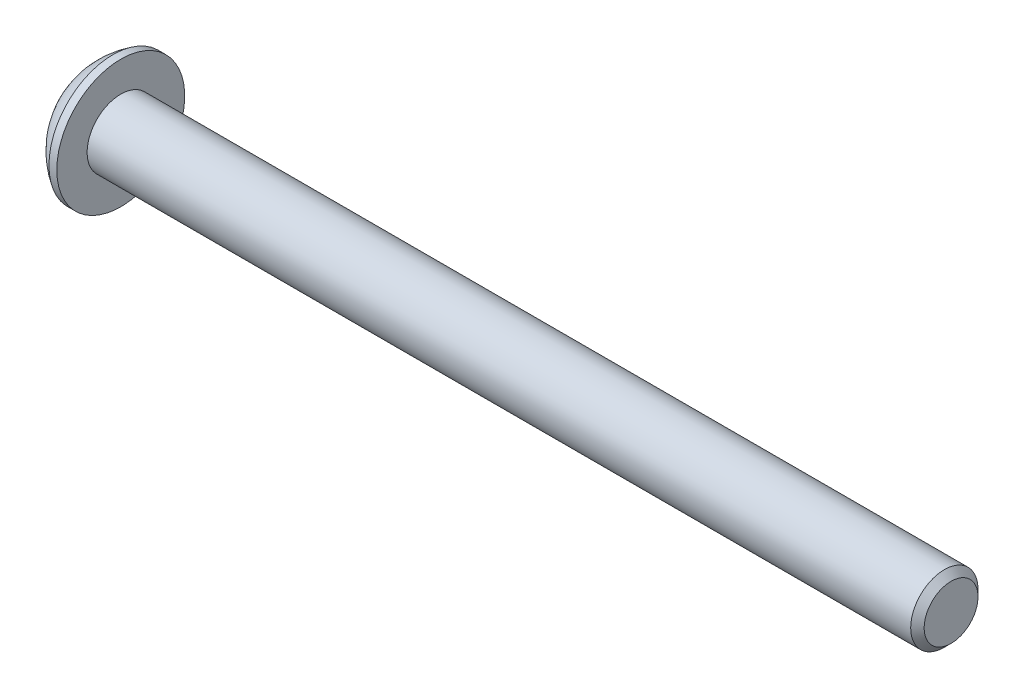
ISO-10303-21;
HEADER;
FILE_DESCRIPTION(('STEP AP214'),'2;1');
FILE_NAME('part.step','',(''),(''),'','','');
FILE_SCHEMA(('AUTOMOTIVE_DESIGN { 1 0 10303 214 1 1 1 1 }'));
ENDSEC;
DATA;
#1=APPLICATION_CONTEXT('core data for automotive mechanical design processes');
#2=APPLICATION_PROTOCOL_DEFINITION('international standard','automotive_design',2000,#1);
#3=PRODUCT_CONTEXT('',#1,'mechanical');
#4=PRODUCT('Part','Part','',(#3));
#5=PRODUCT_RELATED_PRODUCT_CATEGORY('part','',(#4));
#6=PRODUCT_DEFINITION_FORMATION('','',#4);
#7=PRODUCT_DEFINITION_CONTEXT('part definition',#1,'design');
#8=PRODUCT_DEFINITION('design','',#6,#7);
#9=PRODUCT_DEFINITION_SHAPE('','',#8);
#10=(LENGTH_UNIT() NAMED_UNIT(*) SI_UNIT(.MILLI.,.METRE.));
#11=(NAMED_UNIT(*) PLANE_ANGLE_UNIT() SI_UNIT($,.RADIAN.));
#12=(NAMED_UNIT(*) SI_UNIT($,.STERADIAN.) SOLID_ANGLE_UNIT());
#13=UNCERTAINTY_MEASURE_WITH_UNIT(LENGTH_MEASURE(1.E-05),#10,'distance_accuracy_value','');
#14=(GEOMETRIC_REPRESENTATION_CONTEXT(3) GLOBAL_UNCERTAINTY_ASSIGNED_CONTEXT((#13)) GLOBAL_UNIT_ASSIGNED_CONTEXT((#10,
#11,#12)) REPRESENTATION_CONTEXT('',''));
#15=CARTESIAN_POINT('',(0.,0.,0.));
#16=DIRECTION('',(0.,0.,1.));
#17=DIRECTION('',(1.,0.,0.));
#18=AXIS2_PLACEMENT_3D('',#15,#16,#17);
#19=CARTESIAN_POINT('',(3.13199341721866,0.,0.));
#20=DIRECTION('',(-1.,0.,0.));
#21=DIRECTION('',(0.,0.,1.));
#22=AXIS2_PLACEMENT_3D('',#19,#20,#21);
#23=DEGENERATE_TOROIDAL_SURFACE('',#22,0.132247494636802,3.5,.F.);
#24=CARTESIAN_POINT('',(0.,0.,0.));
#25=DIRECTION('',(-1.,0.,0.));
#26=DIRECTION('',(0.,0.,1.));
#27=AXIS2_PLACEMENT_3D('',#24,#25,#26);
#28=CIRCLE('',#27,1.43);
#29=CARTESIAN_POINT('',(0.,0.,1.43));
#30=VERTEX_POINT('',#29);
#31=EDGE_CURVE('E152',#30,#30,#28,.T.);
#32=ORIENTED_EDGE('',*,*,#31,.F.);
#33=EDGE_LOOP('',(#32));
#34=FACE_BOUND('',#33,.T.);
#35=CARTESIAN_POINT('',(1.3,0.,0.));
#36=DIRECTION('',(-1.,0.,0.));
#37=DIRECTION('',(0.,0.,1.));
#38=AXIS2_PLACEMENT_3D('',#35,#36,#37);
#39=CIRCLE('',#38,2.85);
#40=CARTESIAN_POINT('',(1.3,0.,2.85));
#41=VERTEX_POINT('',#40);
#42=EDGE_CURVE('E138',#41,#41,#39,.T.);
#43=ORIENTED_EDGE('',*,*,#42,.T.);
#44=EDGE_LOOP('',(#43));
#45=FACE_BOUND('',#44,.T.);
#46=ADVANCED_FACE('F36',(#34,#45),#23,.F.);
#47=CARTESIAN_POINT('',(0.,1.43,0.));
#48=DIRECTION('',(1.,0.,0.));
#49=DIRECTION('',(0.,0.,-1.));
#50=AXIS2_PLACEMENT_3D('',#47,#48,#49);
#51=PLANE('',#50);
#52=DIRECTION('',(0.,-0.5,-0.866025403784439));
#53=VECTOR('',#52,1.);
#54=CARTESIAN_POINT('',(0.,1.15470053837925,0.));
#55=LINE('',#54,#53);
#56=CARTESIAN_POINT('',(0.,1.15470053837925,0.));
#57=VERTEX_POINT('',#56);
#58=CARTESIAN_POINT('',(0.,0.577350269189626,-1.));
#59=VERTEX_POINT('',#58);
#60=EDGE_CURVE('E125',#57,#59,#55,.T.);
#61=ORIENTED_EDGE('',*,*,#60,.F.);
#62=DIRECTION('',(0.,0.5,-0.866025403784439));
#63=VECTOR('',#62,1.);
#64=CARTESIAN_POINT('',(0.,0.577350269189626,1.));
#65=LINE('',#64,#63);
#66=CARTESIAN_POINT('',(0.,0.577350269189626,1.));
#67=VERTEX_POINT('',#66);
#68=EDGE_CURVE('E51',#67,#57,#65,.T.);
#69=ORIENTED_EDGE('',*,*,#68,.F.);
#70=DIRECTION('',(0.,1.,0.));
#71=VECTOR('',#70,1.);
#72=CARTESIAN_POINT('',(0.,-0.577350269189626,1.));
#73=LINE('',#72,#71);
#74=CARTESIAN_POINT('',(0.,-0.577350269189626,1.));
#75=VERTEX_POINT('',#74);
#76=EDGE_CURVE('E134',#75,#67,#73,.T.);
#77=ORIENTED_EDGE('',*,*,#76,.F.);
#78=DIRECTION('',(0.,0.5,0.866025403784439));
#79=VECTOR('',#78,1.);
#80=CARTESIAN_POINT('',(0.,-1.15470053837925,0.));
#81=LINE('',#80,#79);
#82=CARTESIAN_POINT('',(0.,-1.15470053837925,0.));
#83=VERTEX_POINT('',#82);
#84=EDGE_CURVE('E132',#83,#75,#81,.T.);
#85=ORIENTED_EDGE('',*,*,#84,.F.);
#86=DIRECTION('',(0.,-0.5,0.866025403784439));
#87=VECTOR('',#86,1.);
#88=CARTESIAN_POINT('',(0.,-0.577350269189626,-1.));
#89=LINE('',#88,#87);
#90=CARTESIAN_POINT('',(0.,-0.577350269189626,-1.));
#91=VERTEX_POINT('',#90);
#92=EDGE_CURVE('E99',#91,#83,#89,.T.);
#93=ORIENTED_EDGE('',*,*,#92,.F.);
#94=DIRECTION('',(0.,-1.,0.));
#95=VECTOR('',#94,1.);
#96=CARTESIAN_POINT('',(0.,0.577350269189626,-1.));
#97=LINE('',#96,#95);
#98=EDGE_CURVE('E128',#59,#91,#97,.T.);
#99=ORIENTED_EDGE('',*,*,#98,.F.);
#100=EDGE_LOOP('',(#61,#69,#77,#85,#93,#99));
#101=FACE_BOUND('',#100,.T.);
#102=ORIENTED_EDGE('',*,*,#31,.T.);
#103=EDGE_LOOP('',(#102));
#104=FACE_BOUND('',#103,.T.);
#105=ADVANCED_FACE('F175',(#101,#104),#51,.F.);
#106=CARTESIAN_POINT('',(38.65,0.,0.));
#107=DIRECTION('',(-1.,0.,0.));
#108=DIRECTION('',(0.,0.,1.));
#109=AXIS2_PLACEMENT_3D('',#106,#107,#108);
#110=PLANE('',#109);
#111=CARTESIAN_POINT('',(38.65,0.,0.));
#112=DIRECTION('',(-1.,0.,0.));
#113=DIRECTION('',(0.,0.,1.));
#114=AXIS2_PLACEMENT_3D('',#111,#112,#113);
#115=CIRCLE('',#114,1.19999999999999);
#116=CARTESIAN_POINT('',(38.65,0.,1.19999999999999));
#117=VERTEX_POINT('',#116);
#118=EDGE_CURVE('E11',#117,#117,#115,.F.);
#119=ORIENTED_EDGE('',*,*,#118,.T.);
#120=EDGE_LOOP('',(#119));
#121=FACE_BOUND('',#120,.T.);
#122=ADVANCED_FACE('F180',(#121),#110,.F.);
#123=CARTESIAN_POINT('',(0.,0.,0.));
#124=DIRECTION('',(-1.,0.,0.));
#125=DIRECTION('',(0.,0.,1.));
#126=AXIS2_PLACEMENT_3D('',#123,#124,#125);
#127=CYLINDRICAL_SURFACE('',#126,1.5);
#128=CARTESIAN_POINT('',(38.35,0.,0.));
#129=DIRECTION('',(-1.,0.,0.));
#130=DIRECTION('',(0.,0.,1.));
#131=AXIS2_PLACEMENT_3D('',#128,#129,#130);
#132=CIRCLE('',#131,1.5);
#133=CARTESIAN_POINT('',(38.35,0.,1.5));
#134=VERTEX_POINT('',#133);
#135=EDGE_CURVE('E44',#134,#134,#132,.T.);
#136=ORIENTED_EDGE('',*,*,#135,.T.);
#137=EDGE_LOOP('',(#136));
#138=FACE_BOUND('',#137,.T.);
#139=CARTESIAN_POINT('',(1.65,0.,0.));
#140=DIRECTION('',(-1.,0.,0.));
#141=DIRECTION('',(0.,0.,1.));
#142=AXIS2_PLACEMENT_3D('',#139,#140,#141);
#143=CIRCLE('',#142,1.5);
#144=CARTESIAN_POINT('',(1.65,0.,1.5));
#145=VERTEX_POINT('',#144);
#146=EDGE_CURVE('E149',#145,#145,#143,.T.);
#147=ORIENTED_EDGE('',*,*,#146,.F.);
#148=EDGE_LOOP('',(#147));
#149=FACE_BOUND('',#148,.T.);
#150=ADVANCED_FACE('F157',(#138,#149),#127,.T.);
#151=CARTESIAN_POINT('',(1.65,1.5,0.));
#152=DIRECTION('',(-1.,0.,0.));
#153=DIRECTION('',(0.,0.,1.));
#154=AXIS2_PLACEMENT_3D('',#151,#152,#153);
#155=PLANE('',#154);
#156=CARTESIAN_POINT('',(1.65,0.,0.));
#157=DIRECTION('',(-1.,0.,0.));
#158=DIRECTION('',(0.,0.,1.));
#159=AXIS2_PLACEMENT_3D('',#156,#157,#158);
#160=CIRCLE('',#159,2.85);
#161=CARTESIAN_POINT('',(1.65,0.,2.85));
#162=VERTEX_POINT('',#161);
#163=EDGE_CURVE('E146',#162,#162,#160,.T.);
#164=ORIENTED_EDGE('',*,*,#163,.F.);
#165=EDGE_LOOP('',(#164));
#166=FACE_BOUND('',#165,.T.);
#167=ORIENTED_EDGE('',*,*,#146,.T.);
#168=EDGE_LOOP('',(#167));
#169=FACE_BOUND('',#168,.T.);
#170=ADVANCED_FACE('F170',(#166,#169),#155,.F.);
#171=CARTESIAN_POINT('',(0.,0.,0.));
#172=DIRECTION('',(-1.,0.,0.));
#173=DIRECTION('',(0.,0.,1.));
#174=AXIS2_PLACEMENT_3D('',#171,#172,#173);
#175=CYLINDRICAL_SURFACE('',#174,2.85);
#176=ORIENTED_EDGE('',*,*,#42,.F.);
#177=EDGE_LOOP('',(#176));
#178=FACE_BOUND('',#177,.T.);
#179=ORIENTED_EDGE('',*,*,#163,.T.);
#180=EDGE_LOOP('',(#179));
#181=FACE_BOUND('',#180,.T.);
#182=ADVANCED_FACE('F162',(#178,#181),#175,.T.);
#183=CARTESIAN_POINT('',(38.35,0.,0.));
#184=DIRECTION('',(-1.,0.,0.));
#185=DIRECTION('',(0.,0.,1.));
#186=AXIS2_PLACEMENT_3D('',#183,#184,#185);
#187=CONICAL_SURFACE('',#186,1.5,0.785398163397463);
#188=ORIENTED_EDGE('',*,*,#118,.F.);
#189=EDGE_LOOP('',(#188));
#190=FACE_BOUND('',#189,.T.);
#191=ORIENTED_EDGE('',*,*,#135,.F.);
#192=EDGE_LOOP('',(#191));
#193=FACE_BOUND('',#192,.T.);
#194=ADVANCED_FACE('F38',(#190,#193),#187,.T.);
#195=CARTESIAN_POINT('',(1.,0.577350269189626,1.));
#196=DIRECTION('',(0.,0.866025403784439,0.5));
#197=DIRECTION('',(0.,-0.5,0.866025403784439));
#198=AXIS2_PLACEMENT_3D('',#195,#196,#197);
#199=PLANE('',#198);
#200=ORIENTED_EDGE('',*,*,#68,.T.);
#201=DIRECTION('',(-1.,0.,0.));
#202=VECTOR('',#201,1.);
#203=CARTESIAN_POINT('',(1.,1.15470053837925,0.));
#204=LINE('',#203,#202);
#205=CARTESIAN_POINT('',(1.,1.15470053837925,0.));
#206=VERTEX_POINT('',#205);
#207=EDGE_CURVE('E81',#206,#57,#204,.T.);
#208=ORIENTED_EDGE('',*,*,#207,.F.);
#209=DIRECTION('',(0.,0.5,-0.866025403784439));
#210=VECTOR('',#209,1.);
#211=CARTESIAN_POINT('',(1.,0.577350269189626,1.));
#212=LINE('',#211,#210);
#213=CARTESIAN_POINT('',(1.,0.577350269189626,1.));
#214=VERTEX_POINT('',#213);
#215=EDGE_CURVE('E136',#214,#206,#212,.T.);
#216=ORIENTED_EDGE('',*,*,#215,.F.);
#217=DIRECTION('',(-1.,0.,0.));
#218=VECTOR('',#217,1.);
#219=CARTESIAN_POINT('',(1.,0.577350269189626,1.));
#220=LINE('',#219,#218);
#221=EDGE_CURVE('E59',#214,#67,#220,.T.);
#222=ORIENTED_EDGE('',*,*,#221,.T.);
#223=EDGE_LOOP('',(#200,#208,#216,#222));
#224=FACE_BOUND('',#223,.T.);
#225=ADVANCED_FACE('F161',(#224),#199,.F.);
#226=CARTESIAN_POINT('',(1.,-0.577350269189626,1.));
#227=DIRECTION('',(0.,0.,1.));
#228=DIRECTION('',(0.,-1.,0.));
#229=AXIS2_PLACEMENT_3D('',#226,#227,#228);
#230=PLANE('',#229);
#231=ORIENTED_EDGE('',*,*,#76,.T.);
#232=ORIENTED_EDGE('',*,*,#221,.F.);
#233=DIRECTION('',(0.,1.,0.));
#234=VECTOR('',#233,1.);
#235=CARTESIAN_POINT('',(1.,-0.577350269189626,1.));
#236=LINE('',#235,#234);
#237=CARTESIAN_POINT('',(1.,-0.577350269189626,1.));
#238=VERTEX_POINT('',#237);
#239=EDGE_CURVE('E111',#238,#214,#236,.T.);
#240=ORIENTED_EDGE('',*,*,#239,.F.);
#241=DIRECTION('',(-1.,0.,0.));
#242=VECTOR('',#241,1.);
#243=CARTESIAN_POINT('',(1.,-0.577350269189626,1.));
#244=LINE('',#243,#242);
#245=EDGE_CURVE('E103',#238,#75,#244,.T.);
#246=ORIENTED_EDGE('',*,*,#245,.T.);
#247=EDGE_LOOP('',(#231,#232,#240,#246));
#248=FACE_BOUND('',#247,.T.);
#249=ADVANCED_FACE('F168',(#248),#230,.F.);
#250=CARTESIAN_POINT('',(1.,-1.15470053837925,0.));
#251=DIRECTION('',(0.,-0.866025403784439,0.5));
#252=DIRECTION('',(0.,-0.5,-0.866025403784439));
#253=AXIS2_PLACEMENT_3D('',#250,#251,#252);
#254=PLANE('',#253);
#255=ORIENTED_EDGE('',*,*,#84,.T.);
#256=ORIENTED_EDGE('',*,*,#245,.F.);
#257=DIRECTION('',(0.,0.5,0.866025403784439));
#258=VECTOR('',#257,1.);
#259=CARTESIAN_POINT('',(1.,-1.15470053837925,0.));
#260=LINE('',#259,#258);
#261=CARTESIAN_POINT('',(1.,-1.15470053837925,0.));
#262=VERTEX_POINT('',#261);
#263=EDGE_CURVE('E107',#262,#238,#260,.T.);
#264=ORIENTED_EDGE('',*,*,#263,.F.);
#265=DIRECTION('',(-1.,0.,0.));
#266=VECTOR('',#265,1.);
#267=CARTESIAN_POINT('',(1.,-1.15470053837925,0.));
#268=LINE('',#267,#266);
#269=EDGE_CURVE('E92',#262,#83,#268,.T.);
#270=ORIENTED_EDGE('',*,*,#269,.T.);
#271=EDGE_LOOP('',(#255,#256,#264,#270));
#272=FACE_BOUND('',#271,.T.);
#273=ADVANCED_FACE('F108',(#272),#254,.F.);
#274=CARTESIAN_POINT('',(1.,-0.577350269189626,-1.));
#275=DIRECTION('',(0.,-0.866025403784439,-0.5));
#276=DIRECTION('',(0.,0.5,-0.866025403784439));
#277=AXIS2_PLACEMENT_3D('',#274,#275,#276);
#278=PLANE('',#277);
#279=ORIENTED_EDGE('',*,*,#92,.T.);
#280=ORIENTED_EDGE('',*,*,#269,.F.);
#281=DIRECTION('',(0.,-0.5,0.866025403784439));
#282=VECTOR('',#281,1.);
#283=CARTESIAN_POINT('',(1.,-0.577350269189626,-1.));
#284=LINE('',#283,#282);
#285=CARTESIAN_POINT('',(1.,-0.577350269189626,-1.));
#286=VERTEX_POINT('',#285);
#287=EDGE_CURVE('E96',#286,#262,#284,.T.);
#288=ORIENTED_EDGE('',*,*,#287,.F.);
#289=DIRECTION('',(-1.,0.,0.));
#290=VECTOR('',#289,1.);
#291=CARTESIAN_POINT('',(1.,-0.577350269189626,-1.));
#292=LINE('',#291,#290);
#293=EDGE_CURVE('E104',#286,#91,#292,.T.);
#294=ORIENTED_EDGE('',*,*,#293,.T.);
#295=EDGE_LOOP('',(#279,#280,#288,#294));
#296=FACE_BOUND('',#295,.T.);
#297=ADVANCED_FACE('F94',(#296),#278,.F.);
#298=CARTESIAN_POINT('',(1.,0.577350269189626,-1.));
#299=DIRECTION('',(0.,0.,-1.));
#300=DIRECTION('',(-1.,0.,0.));
#301=AXIS2_PLACEMENT_3D('',#298,#299,#300);
#302=PLANE('',#301);
#303=ORIENTED_EDGE('',*,*,#98,.T.);
#304=ORIENTED_EDGE('',*,*,#293,.F.);
#305=DIRECTION('',(0.,-1.,0.));
#306=VECTOR('',#305,1.);
#307=CARTESIAN_POINT('',(1.,0.577350269189626,-1.));
#308=LINE('',#307,#306);
#309=CARTESIAN_POINT('',(1.,0.577350269189626,-1.));
#310=VERTEX_POINT('',#309);
#311=EDGE_CURVE('E117',#310,#286,#308,.T.);
#312=ORIENTED_EDGE('',*,*,#311,.F.);
#313=DIRECTION('',(-1.,0.,0.));
#314=VECTOR('',#313,1.);
#315=CARTESIAN_POINT('',(1.,0.577350269189626,-1.));
#316=LINE('',#315,#314);
#317=EDGE_CURVE('E141',#310,#59,#316,.T.);
#318=ORIENTED_EDGE('',*,*,#317,.T.);
#319=EDGE_LOOP('',(#303,#304,#312,#318));
#320=FACE_BOUND('',#319,.T.);
#321=ADVANCED_FACE('F197',(#320),#302,.F.);
#322=CARTESIAN_POINT('',(1.,1.15470053837925,0.));
#323=DIRECTION('',(0.,0.866025403784439,-0.5));
#324=DIRECTION('',(0.,0.5,0.866025403784439));
#325=AXIS2_PLACEMENT_3D('',#322,#323,#324);
#326=PLANE('',#325);
#327=ORIENTED_EDGE('',*,*,#60,.T.);
#328=ORIENTED_EDGE('',*,*,#317,.F.);
#329=DIRECTION('',(0.,-0.5,-0.866025403784439));
#330=VECTOR('',#329,1.);
#331=CARTESIAN_POINT('',(1.,1.15470053837925,0.));
#332=LINE('',#331,#330);
#333=EDGE_CURVE('E119',#206,#310,#332,.T.);
#334=ORIENTED_EDGE('',*,*,#333,.F.);
#335=ORIENTED_EDGE('',*,*,#207,.T.);
#336=EDGE_LOOP('',(#327,#328,#334,#335));
#337=FACE_BOUND('',#336,.T.);
#338=ADVANCED_FACE('F194',(#337),#326,.F.);
#339=CARTESIAN_POINT('',(1.,0.,0.));
#340=DIRECTION('',(-1.,0.,0.));
#341=DIRECTION('',(0.,0.,1.));
#342=AXIS2_PLACEMENT_3D('',#339,#340,#341);
#343=PLANE('',#342);
#344=ORIENTED_EDGE('',*,*,#215,.T.);
#345=ORIENTED_EDGE('',*,*,#333,.T.);
#346=ORIENTED_EDGE('',*,*,#311,.T.);
#347=ORIENTED_EDGE('',*,*,#287,.T.);
#348=ORIENTED_EDGE('',*,*,#263,.T.);
#349=ORIENTED_EDGE('',*,*,#239,.T.);
#350=EDGE_LOOP('',(#344,#345,#346,#347,#348,#349));
#351=FACE_BOUND('',#350,.T.);
#352=ADVANCED_FACE('F114',(#351),#343,.T.);
#353=CLOSED_SHELL('',(#46,#105,#122,#150,#170,#182,#194,#225,#249,#273,#297,#321,#338,#352));
#354=MANIFOLD_SOLID_BREP('B2',#353);
#355=ADVANCED_BREP_SHAPE_REPRESENTATION('',(#18,#354),#14);
#356=SHAPE_DEFINITION_REPRESENTATION(#9,#355);
ENDSEC;
END-ISO-10303-21;
